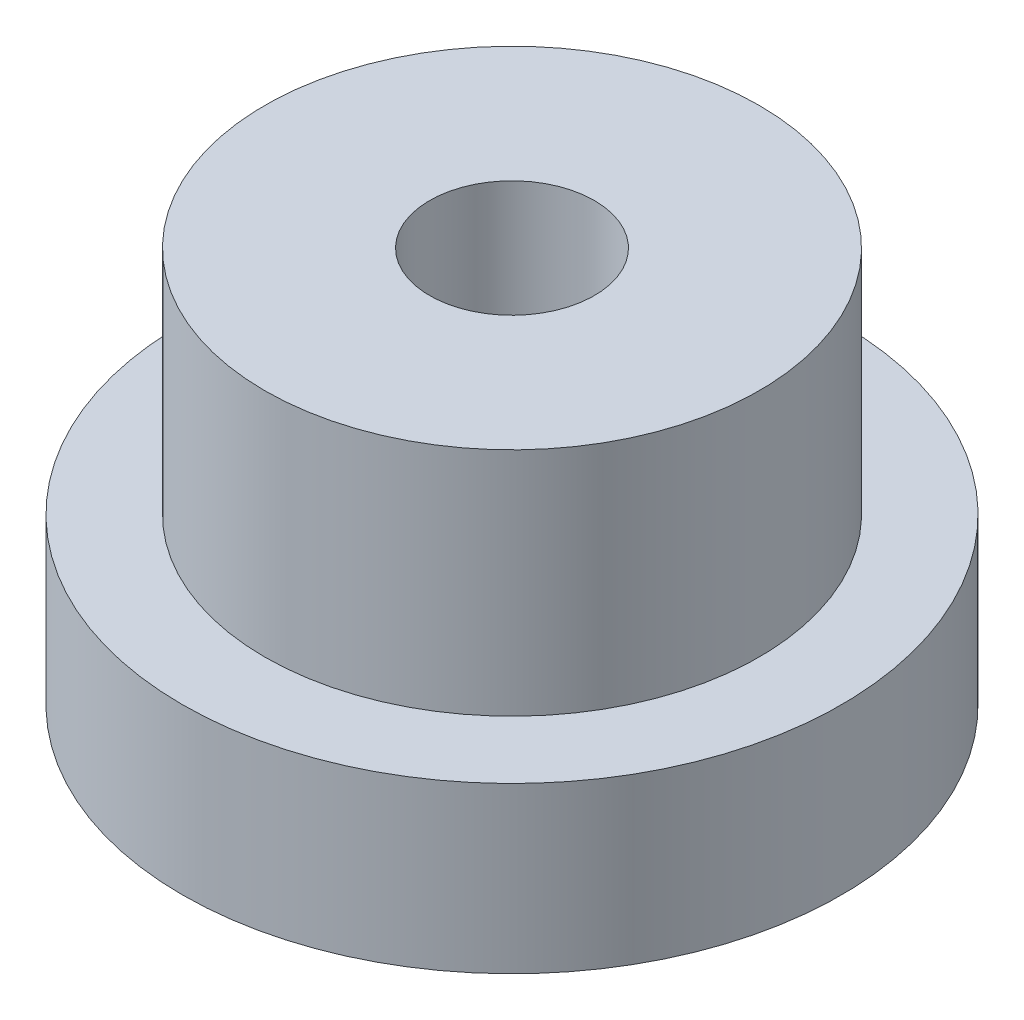
ISO-10303-21;
HEADER;
FILE_DESCRIPTION(('STEP AP214'),'2;1');
FILE_NAME('part.step','',(''),(''),'','','');
FILE_SCHEMA(('AUTOMOTIVE_DESIGN { 1 0 10303 214 1 1 1 1 }'));
ENDSEC;
DATA;
#1=APPLICATION_CONTEXT('core data for automotive mechanical design processes');
#2=APPLICATION_PROTOCOL_DEFINITION('international standard','automotive_design',2000,#1);
#3=PRODUCT_CONTEXT('',#1,'mechanical');
#4=PRODUCT('Part','Part','',(#3));
#5=PRODUCT_RELATED_PRODUCT_CATEGORY('part','',(#4));
#6=PRODUCT_DEFINITION_FORMATION('','',#4);
#7=PRODUCT_DEFINITION_CONTEXT('part definition',#1,'design');
#8=PRODUCT_DEFINITION('design','',#6,#7);
#9=PRODUCT_DEFINITION_SHAPE('','',#8);
#10=(LENGTH_UNIT() NAMED_UNIT(*) SI_UNIT(.MILLI.,.METRE.));
#11=(NAMED_UNIT(*) PLANE_ANGLE_UNIT() SI_UNIT($,.RADIAN.));
#12=(NAMED_UNIT(*) SI_UNIT($,.STERADIAN.) SOLID_ANGLE_UNIT());
#13=UNCERTAINTY_MEASURE_WITH_UNIT(LENGTH_MEASURE(1.E-05),#10,'distance_accuracy_value','');
#14=(GEOMETRIC_REPRESENTATION_CONTEXT(3) GLOBAL_UNCERTAINTY_ASSIGNED_CONTEXT((#13)) GLOBAL_UNIT_ASSIGNED_CONTEXT((#10,
#11,#12)) REPRESENTATION_CONTEXT('',''));
#15=CARTESIAN_POINT('',(0.,0.,0.));
#16=DIRECTION('',(0.,0.,1.));
#17=DIRECTION('',(1.,0.,0.));
#18=AXIS2_PLACEMENT_3D('',#15,#16,#17);
#19=CARTESIAN_POINT('',(0.,5.,0.));
#20=DIRECTION('',(0.,-1.,0.));
#21=DIRECTION('',(0.,0.,-1.));
#22=AXIS2_PLACEMENT_3D('',#19,#20,#21);
#23=CYLINDRICAL_SURFACE('',#22,10.);
#24=CARTESIAN_POINT('',(0.,5.,0.));
#25=DIRECTION('',(0.,1.,0.));
#26=DIRECTION('',(0.,0.,1.));
#27=AXIS2_PLACEMENT_3D('',#24,#25,#26);
#28=CIRCLE('',#27,10.);
#29=CARTESIAN_POINT('',(0.,5.,10.));
#30=VERTEX_POINT('',#29);
#31=EDGE_CURVE('E44',#30,#30,#28,.T.);
#32=ORIENTED_EDGE('',*,*,#31,.F.);
#33=EDGE_LOOP('',(#32));
#34=FACE_BOUND('',#33,.T.);
#35=CARTESIAN_POINT('',(0.,0.,0.));
#36=DIRECTION('',(0.,1.,0.));
#37=DIRECTION('',(0.,0.,1.));
#38=AXIS2_PLACEMENT_3D('',#35,#36,#37);
#39=CIRCLE('',#38,10.);
#40=CARTESIAN_POINT('',(0.,0.,10.));
#41=VERTEX_POINT('',#40);
#42=EDGE_CURVE('E40',#41,#41,#39,.T.);
#43=ORIENTED_EDGE('',*,*,#42,.T.);
#44=EDGE_LOOP('',(#43));
#45=FACE_BOUND('',#44,.T.);
#46=ADVANCED_FACE('F37',(#34,#45),#23,.T.);
#47=CARTESIAN_POINT('',(0.,5.,0.));
#48=DIRECTION('',(0.,1.,0.));
#49=DIRECTION('',(0.,0.,1.));
#50=AXIS2_PLACEMENT_3D('',#47,#48,#49);
#51=PLANE('',#50);
#52=CARTESIAN_POINT('',(0.,5.,0.));
#53=DIRECTION('',(0.,1.,0.));
#54=DIRECTION('',(0.,0.,1.));
#55=AXIS2_PLACEMENT_3D('',#52,#53,#54);
#56=CIRCLE('',#55,7.5);
#57=CARTESIAN_POINT('',(0.,5.,7.5));
#58=VERTEX_POINT('',#57);
#59=EDGE_CURVE('E10',#58,#58,#56,.T.);
#60=ORIENTED_EDGE('',*,*,#59,.F.);
#61=EDGE_LOOP('',(#60));
#62=FACE_BOUND('',#61,.T.);
#63=ORIENTED_EDGE('',*,*,#31,.T.);
#64=EDGE_LOOP('',(#63));
#65=FACE_BOUND('',#64,.T.);
#66=ADVANCED_FACE('F73',(#62,#65),#51,.T.);
#67=CARTESIAN_POINT('',(0.,0.,0.));
#68=DIRECTION('',(0.,1.,0.));
#69=DIRECTION('',(0.,0.,1.));
#70=AXIS2_PLACEMENT_3D('',#67,#68,#69);
#71=PLANE('',#70);
#72=CARTESIAN_POINT('',(0.,0.,0.));
#73=DIRECTION('',(0.,-1.,0.));
#74=DIRECTION('',(0.,0.,-1.));
#75=AXIS2_PLACEMENT_3D('',#72,#73,#74);
#76=CIRCLE('',#75,2.5);
#77=CARTESIAN_POINT('',(0.,0.,-2.5));
#78=VERTEX_POINT('',#77);
#79=EDGE_CURVE('E54',#78,#78,#76,.T.);
#80=ORIENTED_EDGE('',*,*,#79,.F.);
#81=EDGE_LOOP('',(#80));
#82=FACE_BOUND('',#81,.T.);
#83=ORIENTED_EDGE('',*,*,#42,.F.);
#84=EDGE_LOOP('',(#83));
#85=FACE_BOUND('',#84,.T.);
#86=ADVANCED_FACE('F69',(#82,#85),#71,.F.);
#87=CARTESIAN_POINT('',(0.,12.,0.));
#88=DIRECTION('',(0.,-1.,0.));
#89=DIRECTION('',(0.,0.,-1.));
#90=AXIS2_PLACEMENT_3D('',#87,#88,#89);
#91=CYLINDRICAL_SURFACE('',#90,7.5);
#92=CARTESIAN_POINT('',(0.,12.,0.));
#93=DIRECTION('',(0.,1.,0.));
#94=DIRECTION('',(0.,0.,1.));
#95=AXIS2_PLACEMENT_3D('',#92,#93,#94);
#96=CIRCLE('',#95,7.5);
#97=CARTESIAN_POINT('',(0.,12.,7.5));
#98=VERTEX_POINT('',#97);
#99=EDGE_CURVE('E50',#98,#98,#96,.T.);
#100=ORIENTED_EDGE('',*,*,#99,.F.);
#101=EDGE_LOOP('',(#100));
#102=FACE_BOUND('',#101,.T.);
#103=ORIENTED_EDGE('',*,*,#59,.T.);
#104=EDGE_LOOP('',(#103));
#105=FACE_BOUND('',#104,.T.);
#106=ADVANCED_FACE('F72',(#102,#105),#91,.T.);
#107=CARTESIAN_POINT('',(0.,12.,0.));
#108=DIRECTION('',(0.,1.,0.));
#109=DIRECTION('',(0.,0.,1.));
#110=AXIS2_PLACEMENT_3D('',#107,#108,#109);
#111=PLANE('',#110);
#112=CARTESIAN_POINT('',(0.,12.,0.));
#113=DIRECTION('',(0.,-1.,0.));
#114=DIRECTION('',(0.,0.,-1.));
#115=AXIS2_PLACEMENT_3D('',#112,#113,#114);
#116=CIRCLE('',#115,2.5);
#117=CARTESIAN_POINT('',(0.,12.,-2.5));
#118=VERTEX_POINT('',#117);
#119=EDGE_CURVE('E53',#118,#118,#116,.T.);
#120=ORIENTED_EDGE('',*,*,#119,.T.);
#121=EDGE_LOOP('',(#120));
#122=FACE_BOUND('',#121,.T.);
#123=ORIENTED_EDGE('',*,*,#99,.T.);
#124=EDGE_LOOP('',(#123));
#125=FACE_BOUND('',#124,.T.);
#126=ADVANCED_FACE('F60',(#122,#125),#111,.T.);
#127=CARTESIAN_POINT('',(0.,12.,0.));
#128=DIRECTION('',(0.,-1.,0.));
#129=DIRECTION('',(0.,0.,-1.));
#130=AXIS2_PLACEMENT_3D('',#127,#128,#129);
#131=CYLINDRICAL_SURFACE('',#130,2.5);
#132=ORIENTED_EDGE('',*,*,#119,.F.);
#133=EDGE_LOOP('',(#132));
#134=FACE_BOUND('',#133,.T.);
#135=ORIENTED_EDGE('',*,*,#79,.T.);
#136=EDGE_LOOP('',(#135));
#137=FACE_BOUND('',#136,.T.);
#138=ADVANCED_FACE('F63',(#134,#137),#131,.F.);
#139=CLOSED_SHELL('',(#46,#66,#86,#106,#126,#138));
#140=MANIFOLD_SOLID_BREP('B2',#139);
#141=ADVANCED_BREP_SHAPE_REPRESENTATION('',(#18,#140),#14);
#142=SHAPE_DEFINITION_REPRESENTATION(#9,#141);
ENDSEC;
END-ISO-10303-21;
